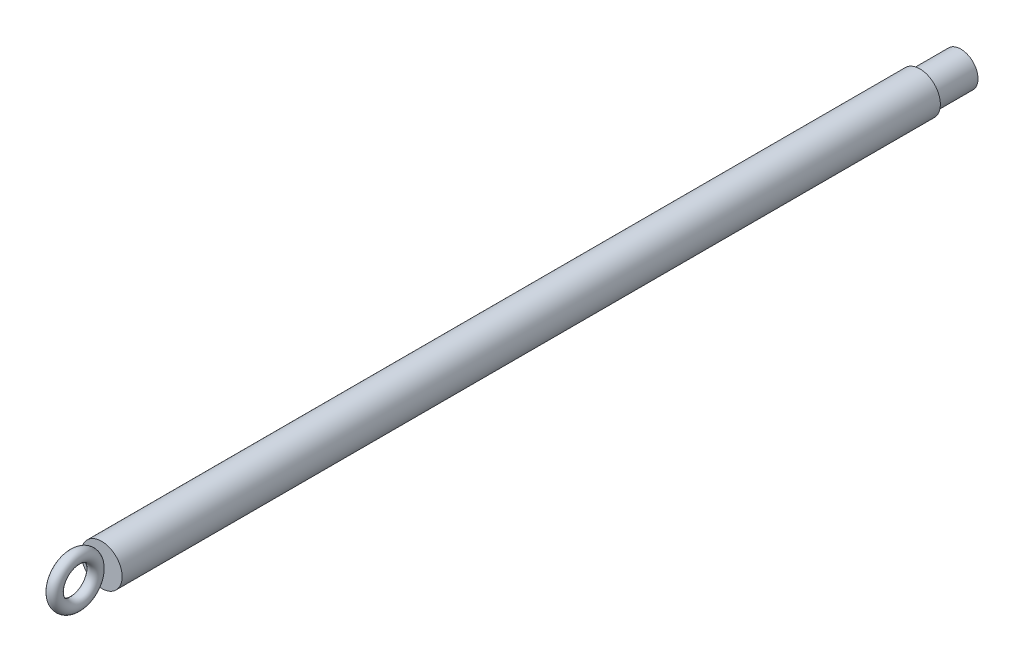
ISO-10303-21;
HEADER;
FILE_DESCRIPTION(('STEP AP214'),'2;1');
FILE_NAME('part.step','',(''),(''),'','','');
FILE_SCHEMA(('AUTOMOTIVE_DESIGN { 1 0 10303 214 1 1 1 1 }'));
ENDSEC;
DATA;
#1=APPLICATION_CONTEXT('core data for automotive mechanical design processes');
#2=APPLICATION_PROTOCOL_DEFINITION('international standard','automotive_design',2000,#1);
#3=PRODUCT_CONTEXT('',#1,'mechanical');
#4=PRODUCT('Part','Part','',(#3));
#5=PRODUCT_RELATED_PRODUCT_CATEGORY('part','',(#4));
#6=PRODUCT_DEFINITION_FORMATION('','',#4);
#7=PRODUCT_DEFINITION_CONTEXT('part definition',#1,'design');
#8=PRODUCT_DEFINITION('design','',#6,#7);
#9=PRODUCT_DEFINITION_SHAPE('','',#8);
#10=(LENGTH_UNIT() NAMED_UNIT(*) SI_UNIT(.MILLI.,.METRE.));
#11=(NAMED_UNIT(*) PLANE_ANGLE_UNIT() SI_UNIT($,.RADIAN.));
#12=(NAMED_UNIT(*) SI_UNIT($,.STERADIAN.) SOLID_ANGLE_UNIT());
#13=UNCERTAINTY_MEASURE_WITH_UNIT(LENGTH_MEASURE(1.E-05),#10,'distance_accuracy_value','');
#14=(GEOMETRIC_REPRESENTATION_CONTEXT(3) GLOBAL_UNCERTAINTY_ASSIGNED_CONTEXT((#13)) GLOBAL_UNIT_ASSIGNED_CONTEXT((#10,
#11,#12)) REPRESENTATION_CONTEXT('',''));
#15=CARTESIAN_POINT('',(0.,0.,0.));
#16=DIRECTION('',(0.,0.,1.));
#17=DIRECTION('',(1.,0.,0.));
#18=AXIS2_PLACEMENT_3D('',#15,#16,#17);
#19=CARTESIAN_POINT('',(0.,0.,108.25));
#20=DIRECTION('',(1.,0.,0.));
#21=DIRECTION('',(0.,0.,-1.));
#22=AXIS2_PLACEMENT_3D('',#19,#20,#21);
#23=TOROIDAL_SURFACE('',#22,2.5,0.750000000000001);
#24=CARTESIAN_POINT('',(0.,0.,105.75));
#25=DIRECTION('',(0.,1.,0.));
#26=DIRECTION('',(0.,0.,1.));
#27=AXIS2_PLACEMENT_3D('',#24,#25,#26);
#28=CIRCLE('',#27,0.750000000000001);
#29=CARTESIAN_POINT('',(0.,0.,105.));
#30=VERTEX_POINT('',#29);
#31=EDGE_CURVE('E11',#30,#30,#28,.T.);
#32=CARTESIAN_POINT('',(0.,0.,108.25));
#33=DIRECTION('',(1.,0.,0.));
#34=DIRECTION('',(0.,0.,-1.));
#35=AXIS2_PLACEMENT_3D('',#32,#33,#34);
#36=CIRCLE('',#35,3.25);
#37=EDGE_CURVE('',#30,#30,#36,.T.);
#38=ORIENTED_EDGE('',*,*,#31,.T.);
#39=ORIENTED_EDGE('',*,*,#31,.F.);
#40=ORIENTED_EDGE('',*,*,#37,.T.);
#41=ORIENTED_EDGE('',*,*,#37,.F.);
#42=EDGE_LOOP('',(#38,#40,#39,#41));
#43=FACE_BOUND('',#42,.T.);
#44=ADVANCED_FACE('F38',(#43),#23,.T.);
#45=CLOSED_SHELL('',(#44));
#46=MANIFOLD_SOLID_BREP('B2',#45);
#47=CARTESIAN_POINT('',(0.,0.,5.));
#48=DIRECTION('',(0.,0.,-1.));
#49=DIRECTION('',(-1.,0.,0.));
#50=AXIS2_PLACEMENT_3D('',#47,#48,#49);
#51=CYLINDRICAL_SURFACE('',#50,2.1);
#52=CARTESIAN_POINT('',(0.,0.,5.));
#53=DIRECTION('',(0.,0.,1.));
#54=DIRECTION('',(1.,0.,0.));
#55=AXIS2_PLACEMENT_3D('',#52,#53,#54);
#56=CIRCLE('',#55,2.1);
#57=CARTESIAN_POINT('',(2.1,0.,5.));
#58=VERTEX_POINT('',#57);
#59=EDGE_CURVE('E37',#58,#58,#56,.T.);
#60=ORIENTED_EDGE('',*,*,#59,.F.);
#61=EDGE_LOOP('',(#60));
#62=FACE_BOUND('',#61,.T.);
#63=CARTESIAN_POINT('',(0.,0.,0.));
#64=DIRECTION('',(0.,0.,1.));
#65=DIRECTION('',(1.,0.,0.));
#66=AXIS2_PLACEMENT_3D('',#63,#64,#65);
#67=CIRCLE('',#66,2.1);
#68=CARTESIAN_POINT('',(2.1,0.,0.));
#69=VERTEX_POINT('',#68);
#70=EDGE_CURVE('E57',#69,#69,#67,.T.);
#71=ORIENTED_EDGE('',*,*,#70,.T.);
#72=EDGE_LOOP('',(#71));
#73=FACE_BOUND('',#72,.T.);
#74=ADVANCED_FACE('F54',(#62,#73),#51,.T.);
#75=CARTESIAN_POINT('',(0.,0.,0.));
#76=DIRECTION('',(0.,0.,1.));
#77=DIRECTION('',(1.,0.,0.));
#78=AXIS2_PLACEMENT_3D('',#75,#76,#77);
#79=PLANE('',#78);
#80=ORIENTED_EDGE('',*,*,#70,.F.);
#81=EDGE_LOOP('',(#80));
#82=FACE_BOUND('',#81,.T.);
#83=ADVANCED_FACE('F77',(#82),#79,.F.);
#84=CARTESIAN_POINT('',(0.,0.,105.));
#85=DIRECTION('',(0.,0.,-1.));
#86=DIRECTION('',(-1.,0.,0.));
#87=AXIS2_PLACEMENT_3D('',#84,#85,#86);
#88=CYLINDRICAL_SURFACE('',#87,2.5);
#89=CARTESIAN_POINT('',(0.,0.,105.));
#90=DIRECTION('',(0.,0.,1.));
#91=DIRECTION('',(1.,0.,0.));
#92=AXIS2_PLACEMENT_3D('',#89,#90,#91);
#93=CIRCLE('',#92,2.5);
#94=CARTESIAN_POINT('',(-2.5,0.,105.));
#95=VERTEX_POINT('',#94);
#96=EDGE_CURVE('E64',#95,#95,#93,.T.);
#97=CARTESIAN_POINT('',(0.,0.,5.));
#98=DIRECTION('',(0.,0.,1.));
#99=DIRECTION('',(1.,0.,0.));
#100=AXIS2_PLACEMENT_3D('',#97,#98,#99);
#101=CIRCLE('',#100,2.5);
#102=CARTESIAN_POINT('',(-2.5,0.,5.));
#103=VERTEX_POINT('',#102);
#104=EDGE_CURVE('E66',#103,#103,#101,.T.);
#105=CARTESIAN_POINT('',(-2.5,0.,105.));
#106=CARTESIAN_POINT('',(-2.5,0.,103.958333333333));
#107=CARTESIAN_POINT('',(-2.5,0.,102.916666666667));
#108=CARTESIAN_POINT('',(-2.5,0.,100.833333333333));
#109=CARTESIAN_POINT('',(-2.5,0.,99.7916666666667));
#110=CARTESIAN_POINT('',(-2.5,0.,97.7083333333333));
#111=CARTESIAN_POINT('',(-2.5,0.,96.6666666666667));
#112=CARTESIAN_POINT('',(-2.5,0.,94.5833333333333));
#113=CARTESIAN_POINT('',(-2.5,0.,93.5416666666667));
#114=CARTESIAN_POINT('',(-2.5,0.,91.4583333333333));
#115=CARTESIAN_POINT('',(-2.5,0.,90.4166666666667));
#116=CARTESIAN_POINT('',(-2.5,0.,88.3333333333333));
#117=CARTESIAN_POINT('',(-2.5,0.,87.2916666666667));
#118=CARTESIAN_POINT('',(-2.5,0.,85.2083333333333));
#119=CARTESIAN_POINT('',(-2.5,0.,84.1666666666667));
#120=CARTESIAN_POINT('',(-2.5,0.,82.0833333333333));
#121=CARTESIAN_POINT('',(-2.5,0.,81.0416666666667));
#122=CARTESIAN_POINT('',(-2.5,0.,78.9583333333333));
#123=CARTESIAN_POINT('',(-2.5,0.,77.9166666666667));
#124=CARTESIAN_POINT('',(-2.5,0.,75.8333333333333));
#125=CARTESIAN_POINT('',(-2.5,0.,74.7916666666667));
#126=CARTESIAN_POINT('',(-2.5,0.,72.7083333333333));
#127=CARTESIAN_POINT('',(-2.5,0.,71.6666666666667));
#128=CARTESIAN_POINT('',(-2.5,0.,69.5833333333333));
#129=CARTESIAN_POINT('',(-2.5,0.,68.5416666666667));
#130=CARTESIAN_POINT('',(-2.5,0.,66.4583333333333));
#131=CARTESIAN_POINT('',(-2.5,0.,65.4166666666667));
#132=CARTESIAN_POINT('',(-2.5,0.,63.3333333333333));
#133=CARTESIAN_POINT('',(-2.5,0.,62.2916666666667));
#134=CARTESIAN_POINT('',(-2.5,0.,60.2083333333333));
#135=CARTESIAN_POINT('',(-2.5,0.,59.1666666666667));
#136=CARTESIAN_POINT('',(-2.5,0.,57.0833333333333));
#137=CARTESIAN_POINT('',(-2.5,0.,56.0416666666667));
#138=CARTESIAN_POINT('',(-2.5,0.,53.9583333333333));
#139=CARTESIAN_POINT('',(-2.5,0.,52.9166666666667));
#140=CARTESIAN_POINT('',(-2.5,0.,50.8333333333333));
#141=CARTESIAN_POINT('',(-2.5,0.,49.7916666666667));
#142=CARTESIAN_POINT('',(-2.5,0.,47.7083333333333));
#143=CARTESIAN_POINT('',(-2.5,0.,46.6666666666667));
#144=CARTESIAN_POINT('',(-2.5,0.,44.5833333333333));
#145=CARTESIAN_POINT('',(-2.5,0.,43.5416666666667));
#146=CARTESIAN_POINT('',(-2.5,0.,41.4583333333333));
#147=CARTESIAN_POINT('',(-2.5,0.,40.4166666666667));
#148=CARTESIAN_POINT('',(-2.5,0.,38.3333333333333));
#149=CARTESIAN_POINT('',(-2.5,0.,37.2916666666667));
#150=CARTESIAN_POINT('',(-2.5,0.,35.2083333333333));
#151=CARTESIAN_POINT('',(-2.5,0.,34.1666666666667));
#152=CARTESIAN_POINT('',(-2.5,0.,32.0833333333333));
#153=CARTESIAN_POINT('',(-2.5,0.,31.0416666666667));
#154=CARTESIAN_POINT('',(-2.5,0.,28.9583333333333));
#155=CARTESIAN_POINT('',(-2.5,0.,27.9166666666667));
#156=CARTESIAN_POINT('',(-2.5,0.,25.8333333333333));
#157=CARTESIAN_POINT('',(-2.5,0.,24.7916666666667));
#158=CARTESIAN_POINT('',(-2.5,0.,22.7083333333333));
#159=CARTESIAN_POINT('',(-2.5,0.,21.6666666666667));
#160=CARTESIAN_POINT('',(-2.5,0.,19.5833333333333));
#161=CARTESIAN_POINT('',(-2.5,0.,18.5416666666667));
#162=CARTESIAN_POINT('',(-2.5,0.,16.4583333333333));
#163=CARTESIAN_POINT('',(-2.5,0.,15.4166666666667));
#164=CARTESIAN_POINT('',(-2.5,0.,13.3333333333333));
#165=CARTESIAN_POINT('',(-2.5,0.,12.2916666666667));
#166=CARTESIAN_POINT('',(-2.5,0.,10.2083333333333));
#167=CARTESIAN_POINT('',(-2.5,0.,9.16666666666667));
#168=CARTESIAN_POINT('',(-2.5,0.,7.08333333333334));
#169=CARTESIAN_POINT('',(-2.5,0.,6.04166666666667));
#170=CARTESIAN_POINT('',(-2.5,0.,5.));
#171=B_SPLINE_CURVE_WITH_KNOTS('',3,(#105,#106,#107,#108,#109,#110,#111,#112,#113,#114,#115,
#116,#117,#118,#119,#120,#121,#122,#123,#124,#125,#126,#127,#128,#129,#130,#131,#132,#133,#134,
#135,#136,#137,#138,#139,#140,#141,#142,#143,#144,#145,#146,#147,#148,#149,#150,#151,#152,#153,
#154,#155,#156,#157,#158,#159,#160,#161,#162,#163,#164,#165,#166,#167,#168,#169,#170),
.UNSPECIFIED.,.F.,.F.,(4,2,2,2,2,2,2,2,2,2,2,2,2,2,2,2,2,2,2,2,2,2,2,2,2,2,2,2,2,2,2,2,4),(0.,
3.12499999999999,6.24999999999999,9.37499999999999,12.5,15.625,18.75,21.875,25.,28.125,31.25,
34.375,37.5,40.625,43.75,46.875,50.,53.125,56.25,59.375,62.5,65.625,68.75,71.875,75.,78.125,
81.25,84.375,87.5,90.625,93.75,96.875,100.),.UNSPECIFIED.);
#172=EDGE_CURVE('BSEAM74',#95,#103,#171,.T.);
#173=ORIENTED_EDGE('',*,*,#96,.F.);
#174=ORIENTED_EDGE('',*,*,#104,.T.);
#175=ORIENTED_EDGE('',*,*,#172,.T.);
#176=ORIENTED_EDGE('',*,*,#172,.F.);
#177=EDGE_LOOP('',(#173,#175,#174,#176));
#178=FACE_BOUND('',#177,.T.);
#179=ADVANCED_FACE('F74',(#178),#88,.T.);
#180=CARTESIAN_POINT('',(0.,0.,105.));
#181=DIRECTION('',(0.,0.,1.));
#182=DIRECTION('',(1.,0.,0.));
#183=AXIS2_PLACEMENT_3D('',#180,#181,#182);
#184=PLANE('',#183);
#185=ORIENTED_EDGE('',*,*,#96,.T.);
#186=EDGE_LOOP('',(#185));
#187=FACE_BOUND('',#186,.T.);
#188=ADVANCED_FACE('F72',(#187),#184,.T.);
#189=CARTESIAN_POINT('',(0.,0.,5.));
#190=DIRECTION('',(0.,0.,1.));
#191=DIRECTION('',(1.,0.,0.));
#192=AXIS2_PLACEMENT_3D('',#189,#190,#191);
#193=PLANE('',#192);
#194=ORIENTED_EDGE('',*,*,#59,.T.);
#195=EDGE_LOOP('',(#194));
#196=FACE_BOUND('',#195,.T.);
#197=ORIENTED_EDGE('',*,*,#104,.F.);
#198=EDGE_LOOP('',(#197));
#199=FACE_BOUND('',#198,.T.);
#200=ADVANCED_FACE('F81',(#196,#199),#193,.F.);
#201=CLOSED_SHELL('',(#74,#83,#179,#188,#200));
#202=MANIFOLD_SOLID_BREP('B6',#201);
#203=ADVANCED_BREP_SHAPE_REPRESENTATION('',(#18,#46,#202),#14);
#204=SHAPE_DEFINITION_REPRESENTATION(#9,#203);
ENDSEC;
END-ISO-10303-21;
